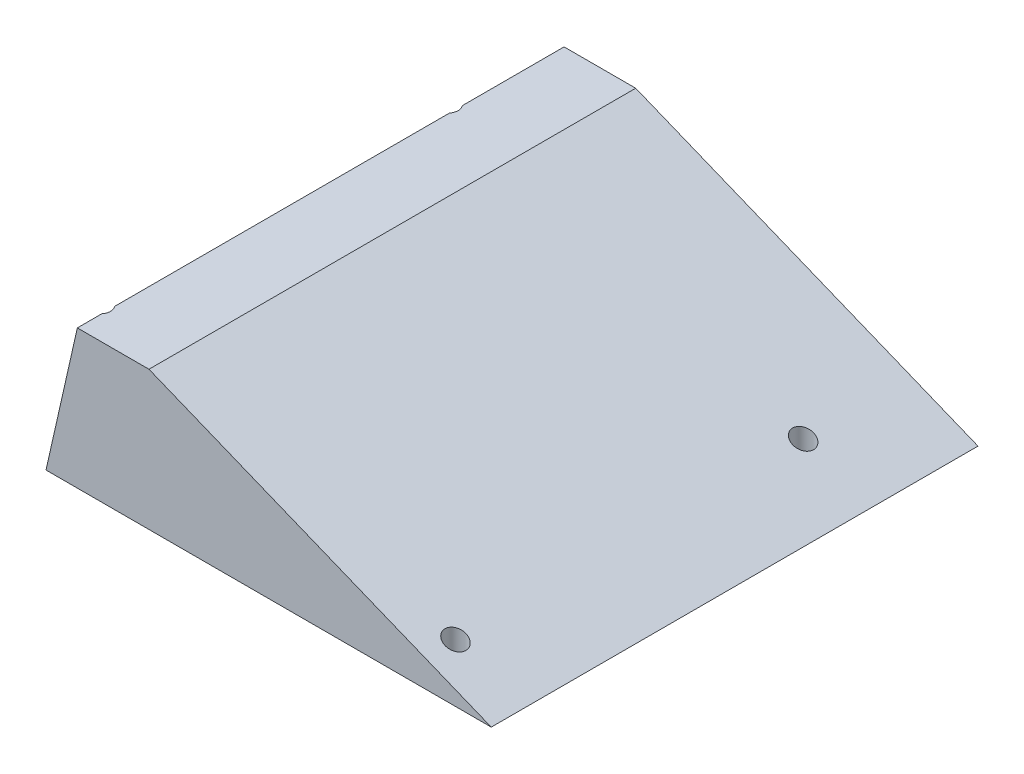
ISO-10303-21;
HEADER;
FILE_DESCRIPTION(('STEP AP214'),'2;1');
FILE_NAME('part.step','',(''),(''),'','','');
FILE_SCHEMA(('AUTOMOTIVE_DESIGN { 1 0 10303 214 1 1 1 1 }'));
ENDSEC;
DATA;
#1=APPLICATION_CONTEXT('core data for automotive mechanical design processes');
#2=APPLICATION_PROTOCOL_DEFINITION('international standard','automotive_design',2000,#1);
#3=PRODUCT_CONTEXT('',#1,'mechanical');
#4=PRODUCT('Part','Part','',(#3));
#5=PRODUCT_RELATED_PRODUCT_CATEGORY('part','',(#4));
#6=PRODUCT_DEFINITION_FORMATION('','',#4);
#7=PRODUCT_DEFINITION_CONTEXT('part definition',#1,'design');
#8=PRODUCT_DEFINITION('design','',#6,#7);
#9=PRODUCT_DEFINITION_SHAPE('','',#8);
#10=(LENGTH_UNIT() NAMED_UNIT(*) SI_UNIT(.MILLI.,.METRE.));
#11=(NAMED_UNIT(*) PLANE_ANGLE_UNIT() SI_UNIT($,.RADIAN.));
#12=(NAMED_UNIT(*) SI_UNIT($,.STERADIAN.) SOLID_ANGLE_UNIT());
#13=UNCERTAINTY_MEASURE_WITH_UNIT(LENGTH_MEASURE(1.E-05),#10,'distance_accuracy_value','');
#14=(GEOMETRIC_REPRESENTATION_CONTEXT(3) GLOBAL_UNCERTAINTY_ASSIGNED_CONTEXT((#13)) GLOBAL_UNIT_ASSIGNED_CONTEXT((#10,
#11,#12)) REPRESENTATION_CONTEXT('',''));
#15=CARTESIAN_POINT('',(0.,0.,0.));
#16=DIRECTION('',(0.,0.,1.));
#17=DIRECTION('',(1.,0.,0.));
#18=AXIS2_PLACEMENT_3D('',#15,#16,#17);
#19=CARTESIAN_POINT('',(13.4332721150903,10.8252450173548,63.));
#20=DIRECTION('',(-0.970371375639122,0.241618280227795,0.));
#21=DIRECTION('',(-0.241618280227795,-0.970371375639122,0.));
#22=AXIS2_PLACEMENT_3D('',#19,#20,#21);
#23=PLANE('',#22);
#24=DIRECTION('',(0.,0.,1.));
#25=VECTOR('',#24,1.);
#26=CARTESIAN_POINT('',(13.2277896710843,9.99999999999999,63.));
#27=LINE('',#26,#25);
#28=CARTESIAN_POINT('',(13.2277896710843,10.,0.));
#29=VERTEX_POINT('',#28);
#30=CARTESIAN_POINT('',(13.2277896710843,10.,8.));
#31=VERTEX_POINT('',#30);
#32=EDGE_CURVE('E183',#29,#31,#27,.T.);
#33=ORIENTED_EDGE('',*,*,#32,.F.);
#34=DIRECTION('',(0.241618280227795,0.970371375639122,0.));
#35=VECTOR('',#34,1.);
#36=CARTESIAN_POINT('',(13.4332721150903,10.8252450173548,0.));
#37=LINE('',#36,#35);
#38=CARTESIAN_POINT('',(13.4332721150903,10.8252450173548,0.));
#39=VERTEX_POINT('',#38);
#40=EDGE_CURVE('E205',#29,#39,#37,.T.);
#41=ORIENTED_EDGE('',*,*,#40,.T.);
#42=DIRECTION('',(0.,0.,-1.));
#43=VECTOR('',#42,1.);
#44=CARTESIAN_POINT('',(13.4332721150903,10.8252450173548,63.));
#45=LINE('',#44,#43);
#46=CARTESIAN_POINT('',(13.4332721150903,10.8252450173548,57.));
#47=VERTEX_POINT('',#46);
#48=EDGE_CURVE('E212',#47,#39,#45,.T.);
#49=ORIENTED_EDGE('',*,*,#48,.F.);
#50=DIRECTION('',(-0.241618280227795,-0.970371375639122,0.));
#51=VECTOR('',#50,1.);
#52=CARTESIAN_POINT('',(13.4332721150903,10.8252450173548,57.));
#53=LINE('',#52,#51);
#54=CARTESIAN_POINT('',(10.7378328741965,0.,57.));
#55=VERTEX_POINT('',#54);
#56=EDGE_CURVE('E189',#47,#55,#53,.T.);
#57=ORIENTED_EDGE('',*,*,#56,.T.);
#58=DIRECTION('',(0.,0.,-1.));
#59=VECTOR('',#58,1.);
#60=CARTESIAN_POINT('',(10.7378328741965,0.,63.));
#61=LINE('',#60,#59);
#62=CARTESIAN_POINT('',(10.7378328741965,0.,8.));
#63=VERTEX_POINT('',#62);
#64=EDGE_CURVE('E142',#55,#63,#61,.T.);
#65=ORIENTED_EDGE('',*,*,#64,.T.);
#66=DIRECTION('',(-0.241618280227795,-0.970371375639122,0.));
#67=VECTOR('',#66,1.);
#68=CARTESIAN_POINT('',(13.4332721150903,10.8252450173548,8.));
#69=LINE('',#68,#67);
#70=EDGE_CURVE('E187',#31,#63,#69,.T.);
#71=ORIENTED_EDGE('',*,*,#70,.F.);
#72=EDGE_LOOP('',(#33,#41,#49,#57,#65,#71));
#73=FACE_BOUND('',#72,.T.);
#74=ADVANCED_FACE('F32',(#73),#23,.F.);
#75=CARTESIAN_POINT('',(9.42653810835628,17.9645165202627,63.));
#76=DIRECTION('',(0.975427958578046,-0.220318627501776,0.));
#77=DIRECTION('',(0.220318627501776,0.975427958578046,0.));
#78=AXIS2_PLACEMENT_3D('',#75,#76,#77);
#79=PLANE('',#78);
#80=DIRECTION('',(0.,0.,-1.));
#81=VECTOR('',#80,1.);
#82=CARTESIAN_POINT('',(9.42653810835628,17.9645165202627,63.));
#83=LINE('',#82,#81);
#84=CARTESIAN_POINT('',(9.42653810835628,17.9645165202627,58.1609908221686));
#85=VERTEX_POINT('',#84);
#86=CARTESIAN_POINT('',(9.42653810835628,17.9645165202627,14.8390091778314));
#87=VERTEX_POINT('',#86);
#88=EDGE_CURVE('E129',#85,#87,#83,.T.);
#89=ORIENTED_EDGE('',*,*,#88,.T.);
#90=CARTESIAN_POINT('',(8.36891643709825,13.2820538549812,14.));
#91=DIRECTION('',(0.975427958578046,-0.220318627501776,0.));
#92=DIRECTION('',(-0.220318627501776,-0.975427958578046,0.));
#93=AXIS2_PLACEMENT_3D('',#90,#91,#92);
#94=ELLIPSE('',#93,6.12748915199699,1.35);
#95=CARTESIAN_POINT('',(9.42653810835628,17.9645165202627,13.1609908221686));
#96=VERTEX_POINT('',#95);
#97=EDGE_CURVE('E48',#87,#96,#94,.T.);
#98=ORIENTED_EDGE('',*,*,#97,.T.);
#99=CARTESIAN_POINT('',(9.42653810835628,17.9645165202627,0.));
#100=VERTEX_POINT('',#99);
#101=EDGE_CURVE('E127',#96,#100,#83,.T.);
#102=ORIENTED_EDGE('',*,*,#101,.T.);
#103=DIRECTION('',(-0.220318627501776,-0.975427958578046,0.));
#104=VECTOR('',#103,1.);
#105=CARTESIAN_POINT('',(9.42653810835628,17.9645165202627,0.));
#106=LINE('',#105,#104);
#107=CARTESIAN_POINT('',(7.62760325824444,10.,0.));
#108=VERTEX_POINT('',#107);
#109=EDGE_CURVE('E223',#100,#108,#106,.T.);
#110=ORIENTED_EDGE('',*,*,#109,.T.);
#111=DIRECTION('',(0.,0.,-1.));
#112=VECTOR('',#111,1.);
#113=CARTESIAN_POINT('',(7.62760325824444,9.99999999999999,63.));
#114=LINE('',#113,#112);
#115=CARTESIAN_POINT('',(7.62760325824444,10.,8.));
#116=VERTEX_POINT('',#115);
#117=EDGE_CURVE('E181',#116,#108,#114,.T.);
#118=ORIENTED_EDGE('',*,*,#117,.F.);
#119=DIRECTION('',(0.220318627501776,0.975427958578046,0.));
#120=VECTOR('',#119,1.);
#121=CARTESIAN_POINT('',(9.42653810835628,17.9645165202627,8.));
#122=LINE('',#121,#120);
#123=CARTESIAN_POINT('',(5.36891643709825,0.,8.));
#124=VERTEX_POINT('',#123);
#125=EDGE_CURVE('E185',#124,#116,#122,.T.);
#126=ORIENTED_EDGE('',*,*,#125,.F.);
#127=DIRECTION('',(0.,0.,-1.));
#128=VECTOR('',#127,1.);
#129=CARTESIAN_POINT('',(5.36891643709825,0.,63.));
#130=LINE('',#129,#128);
#131=CARTESIAN_POINT('',(5.36891643709825,0.,63.));
#132=VERTEX_POINT('',#131);
#133=EDGE_CURVE('E138',#132,#124,#130,.T.);
#134=ORIENTED_EDGE('',*,*,#133,.F.);
#135=DIRECTION('',(-0.220318627501776,-0.975427958578046,0.));
#136=VECTOR('',#135,1.);
#137=CARTESIAN_POINT('',(9.42653810835628,17.9645165202627,63.));
#138=LINE('',#137,#136);
#139=CARTESIAN_POINT('',(9.42653810835628,17.9645165202627,63.));
#140=VERTEX_POINT('',#139);
#141=EDGE_CURVE('E209',#140,#132,#138,.T.);
#142=ORIENTED_EDGE('',*,*,#141,.F.);
#143=CARTESIAN_POINT('',(9.42653810835628,17.9645165202627,59.8390091778314));
#144=VERTEX_POINT('',#143);
#145=EDGE_CURVE('E140',#140,#144,#83,.T.);
#146=ORIENTED_EDGE('',*,*,#145,.T.);
#147=CARTESIAN_POINT('',(8.36891643709825,13.2820538549812,59.));
#148=DIRECTION('',(0.975427958578046,-0.220318627501776,0.));
#149=DIRECTION('',(-0.220318627501776,-0.975427958578046,0.));
#150=AXIS2_PLACEMENT_3D('',#147,#148,#149);
#151=ELLIPSE('',#150,6.12748915199699,1.35);
#152=EDGE_CURVE('E54',#144,#85,#151,.T.);
#153=ORIENTED_EDGE('',*,*,#152,.T.);
#154=EDGE_LOOP('',(#89,#98,#102,#110,#118,#126,#134,#142,#146,#153));
#155=FACE_BOUND('',#154,.T.);
#156=ADVANCED_FACE('F125',(#155),#79,.F.);
#157=CARTESIAN_POINT('',(5.36891643709825,0.,63.));
#158=DIRECTION('',(0.,1.,0.));
#159=DIRECTION('',(0.,0.,1.));
#160=AXIS2_PLACEMENT_3D('',#157,#158,#159);
#161=PLANE('',#160);
#162=CARTESIAN_POINT('',(54.3689164370982,0.,59.));
#163=DIRECTION('',(0.,-1.,0.));
#164=DIRECTION('',(0.,0.,-1.));
#165=AXIS2_PLACEMENT_3D('',#162,#163,#164);
#166=CIRCLE('',#165,1.35);
#167=CARTESIAN_POINT('',(54.3689164370982,0.,57.65));
#168=VERTEX_POINT('',#167);
#169=EDGE_CURVE('E131',#168,#168,#166,.T.);
#170=ORIENTED_EDGE('',*,*,#169,.F.);
#171=EDGE_LOOP('',(#170));
#172=FACE_BOUND('',#171,.T.);
#173=CARTESIAN_POINT('',(54.3689164370983,0.,14.));
#174=DIRECTION('',(0.,-1.,0.));
#175=DIRECTION('',(0.,0.,-1.));
#176=AXIS2_PLACEMENT_3D('',#173,#174,#175);
#177=CIRCLE('',#176,1.35);
#178=CARTESIAN_POINT('',(54.3689164370983,0.,12.65));
#179=VERTEX_POINT('',#178);
#180=EDGE_CURVE('E374',#179,#179,#177,.T.);
#181=ORIENTED_EDGE('',*,*,#180,.F.);
#182=EDGE_LOOP('',(#181));
#183=FACE_BOUND('',#182,.T.);
#184=CARTESIAN_POINT('',(8.36891643709825,0.,14.));
#185=DIRECTION('',(0.,-1.,0.));
#186=DIRECTION('',(0.,0.,-1.));
#187=AXIS2_PLACEMENT_3D('',#184,#185,#186);
#188=CIRCLE('',#187,1.35);
#189=CARTESIAN_POINT('',(8.36891643709825,0.,12.65));
#190=VERTEX_POINT('',#189);
#191=EDGE_CURVE('E377',#190,#190,#188,.T.);
#192=ORIENTED_EDGE('',*,*,#191,.F.);
#193=EDGE_LOOP('',(#192));
#194=FACE_BOUND('',#193,.T.);
#195=CARTESIAN_POINT('',(8.36891643709825,0.,59.));
#196=DIRECTION('',(0.,-1.,0.));
#197=DIRECTION('',(0.,0.,-1.));
#198=AXIS2_PLACEMENT_3D('',#195,#196,#197);
#199=CIRCLE('',#198,1.35);
#200=CARTESIAN_POINT('',(8.36891643709825,0.,57.65));
#201=VERTEX_POINT('',#200);
#202=EDGE_CURVE('E166',#201,#201,#199,.T.);
#203=ORIENTED_EDGE('',*,*,#202,.F.);
#204=EDGE_LOOP('',(#203));
#205=FACE_BOUND('',#204,.T.);
#206=DIRECTION('',(-1.,0.,0.));
#207=VECTOR('',#206,1.);
#208=CARTESIAN_POINT('',(19.,0.,8.));
#209=LINE('',#208,#207);
#210=EDGE_CURVE('E173',#63,#124,#209,.T.);
#211=ORIENTED_EDGE('',*,*,#210,.F.);
#212=ORIENTED_EDGE('',*,*,#64,.F.);
#213=DIRECTION('',(1.,0.,0.));
#214=VECTOR('',#213,1.);
#215=CARTESIAN_POINT('',(10.7378328741965,0.,57.));
#216=LINE('',#215,#214);
#217=CARTESIAN_POINT('',(31.5,0.,57.));
#218=VERTEX_POINT('',#217);
#219=EDGE_CURVE('E192',#55,#218,#216,.T.);
#220=ORIENTED_EDGE('',*,*,#219,.T.);
#221=DIRECTION('',(0.,0.,-1.));
#222=VECTOR('',#221,1.);
#223=CARTESIAN_POINT('',(31.5,0.,63.));
#224=LINE('',#223,#222);
#225=CARTESIAN_POINT('',(31.5,0.,0.));
#226=VERTEX_POINT('',#225);
#227=EDGE_CURVE('E153',#218,#226,#224,.T.);
#228=ORIENTED_EDGE('',*,*,#227,.T.);
#229=DIRECTION('',(1.,0.,0.));
#230=VECTOR('',#229,1.);
#231=CARTESIAN_POINT('',(31.5,0.,0.));
#232=LINE('',#231,#230);
#233=CARTESIAN_POINT('',(63.,0.,0.));
#234=VERTEX_POINT('',#233);
#235=EDGE_CURVE('E218',#226,#234,#232,.T.);
#236=ORIENTED_EDGE('',*,*,#235,.T.);
#237=DIRECTION('',(0.,0.,-1.));
#238=VECTOR('',#237,1.);
#239=CARTESIAN_POINT('',(63.,0.,63.));
#240=LINE('',#239,#238);
#241=CARTESIAN_POINT('',(63.,0.,63.));
#242=VERTEX_POINT('',#241);
#243=EDGE_CURVE('E149',#242,#234,#240,.T.);
#244=ORIENTED_EDGE('',*,*,#243,.F.);
#245=DIRECTION('',(1.,0.,0.));
#246=VECTOR('',#245,1.);
#247=CARTESIAN_POINT('',(31.5,0.,63.));
#248=LINE('',#247,#246);
#249=EDGE_CURVE('E202',#132,#242,#248,.T.);
#250=ORIENTED_EDGE('',*,*,#249,.F.);
#251=ORIENTED_EDGE('',*,*,#133,.T.);
#252=EDGE_LOOP('',(#211,#212,#220,#228,#236,#244,#250,#251));
#253=FACE_BOUND('',#252,.T.);
#254=ADVANCED_FACE('F236',(#172,#183,#194,#205,#253),#161,.F.);
#255=CARTESIAN_POINT('',(0.,0.,0.));
#256=DIRECTION('',(0.,0.,-1.));
#257=DIRECTION('',(-1.,0.,0.));
#258=AXIS2_PLACEMENT_3D('',#255,#256,#257);
#259=PLANE('',#258);
#260=ORIENTED_EDGE('',*,*,#40,.F.);
#261=DIRECTION('',(-1.,0.,0.));
#262=VECTOR('',#261,1.);
#263=CARTESIAN_POINT('',(0.,10.,0.));
#264=LINE('',#263,#262);
#265=EDGE_CURVE('E159',#29,#108,#264,.T.);
#266=ORIENTED_EDGE('',*,*,#265,.T.);
#267=ORIENTED_EDGE('',*,*,#109,.F.);
#268=DIRECTION('',(-1.,0.,0.));
#269=VECTOR('',#268,1.);
#270=CARTESIAN_POINT('',(18.6961575847282,17.9645165202627,0.));
#271=LINE('',#270,#269);
#272=CARTESIAN_POINT('',(18.6961575847282,17.9645165202627,0.));
#273=VERTEX_POINT('',#272);
#274=EDGE_CURVE('E136',#273,#100,#271,.T.);
#275=ORIENTED_EDGE('',*,*,#274,.F.);
#276=DIRECTION('',(-0.926713780591244,0.375767972108166,0.));
#277=VECTOR('',#276,1.);
#278=CARTESIAN_POINT('',(63.,0.,0.));
#279=LINE('',#278,#277);
#280=EDGE_CURVE('E220',#234,#273,#279,.T.);
#281=ORIENTED_EDGE('',*,*,#280,.F.);
#282=ORIENTED_EDGE('',*,*,#235,.F.);
#283=DIRECTION('',(0.364550638650222,-0.93118356507174,0.));
#284=VECTOR('',#283,1.);
#285=CARTESIAN_POINT('',(27.2620064049157,10.8252450173548,0.));
#286=LINE('',#285,#284);
#287=CARTESIAN_POINT('',(27.2620064049157,10.8252450173548,0.));
#288=VERTEX_POINT('',#287);
#289=EDGE_CURVE('E215',#288,#226,#286,.T.);
#290=ORIENTED_EDGE('',*,*,#289,.F.);
#291=DIRECTION('',(1.,0.,0.));
#292=VECTOR('',#291,1.);
#293=CARTESIAN_POINT('',(13.4332721150903,10.8252450173548,0.));
#294=LINE('',#293,#292);
#295=EDGE_CURVE('E201',#39,#288,#294,.T.);
#296=ORIENTED_EDGE('',*,*,#295,.F.);
#297=EDGE_LOOP('',(#260,#266,#267,#275,#281,#282,#290,#296));
#298=FACE_BOUND('',#297,.T.);
#299=ADVANCED_FACE('F248',(#298),#259,.T.);
#300=CARTESIAN_POINT('',(13.4332721150903,10.8252450173548,63.));
#301=DIRECTION('',(0.,1.,0.));
#302=DIRECTION('',(0.,0.,1.));
#303=AXIS2_PLACEMENT_3D('',#300,#301,#302);
#304=PLANE('',#303);
#305=DIRECTION('',(-1.,0.,0.));
#306=VECTOR('',#305,1.);
#307=CARTESIAN_POINT('',(27.2620064049157,10.8252450173548,57.));
#308=LINE('',#307,#306);
#309=CARTESIAN_POINT('',(27.2620064049157,10.8252450173548,57.));
#310=VERTEX_POINT('',#309);
#311=EDGE_CURVE('E198',#310,#47,#308,.T.);
#312=ORIENTED_EDGE('',*,*,#311,.T.);
#313=ORIENTED_EDGE('',*,*,#48,.T.);
#314=ORIENTED_EDGE('',*,*,#295,.T.);
#315=DIRECTION('',(0.,0.,-1.));
#316=VECTOR('',#315,1.);
#317=CARTESIAN_POINT('',(27.2620064049157,10.8252450173548,63.));
#318=LINE('',#317,#316);
#319=EDGE_CURVE('E157',#310,#288,#318,.T.);
#320=ORIENTED_EDGE('',*,*,#319,.F.);
#321=EDGE_LOOP('',(#312,#313,#314,#320));
#322=FACE_BOUND('',#321,.T.);
#323=ADVANCED_FACE('F34',(#322),#304,.F.);
#324=CARTESIAN_POINT('',(27.2620064049157,10.8252450173548,63.));
#325=DIRECTION('',(0.93118356507174,0.364550638650222,0.));
#326=DIRECTION('',(-0.364550638650222,0.93118356507174,0.));
#327=AXIS2_PLACEMENT_3D('',#324,#325,#326);
#328=PLANE('',#327);
#329=DIRECTION('',(-0.364550638650222,0.93118356507174,0.));
#330=VECTOR('',#329,1.);
#331=CARTESIAN_POINT('',(31.5,0.,57.));
#332=LINE('',#331,#330);
#333=EDGE_CURVE('E195',#218,#310,#332,.T.);
#334=ORIENTED_EDGE('',*,*,#333,.T.);
#335=ORIENTED_EDGE('',*,*,#319,.T.);
#336=ORIENTED_EDGE('',*,*,#289,.T.);
#337=ORIENTED_EDGE('',*,*,#227,.F.);
#338=EDGE_LOOP('',(#334,#335,#336,#337));
#339=FACE_BOUND('',#338,.T.);
#340=ADVANCED_FACE('F256',(#339),#328,.F.);
#341=CARTESIAN_POINT('',(63.,0.,63.));
#342=DIRECTION('',(-0.375767972108166,-0.926713780591244,0.));
#343=DIRECTION('',(0.926713780591244,-0.375767972108166,0.));
#344=AXIS2_PLACEMENT_3D('',#341,#342,#343);
#345=PLANE('',#344);
#346=CARTESIAN_POINT('',(54.3689164370982,3.49976965429229,59.));
#347=DIRECTION('',(-0.375767972108166,-0.926713780591244,0.));
#348=DIRECTION('',(0.926713780591244,-0.375767972108166,0.));
#349=AXIS2_PLACEMENT_3D('',#346,#347,#348);
#350=ELLIPSE('',#349,1.45676046722721,1.35);
#351=CARTESIAN_POINT('',(55.7189164370982,2.95236572767498,59.));
#352=VERTEX_POINT('',#351);
#353=EDGE_CURVE('E36',#352,#352,#350,.T.);
#354=ORIENTED_EDGE('',*,*,#353,.T.);
#355=EDGE_LOOP('',(#354));
#356=FACE_BOUND('',#355,.T.);
#357=CARTESIAN_POINT('',(54.3689164370983,3.49976965429229,14.));
#358=DIRECTION('',(-0.375767972108166,-0.926713780591244,0.));
#359=DIRECTION('',(0.926713780591244,-0.375767972108166,0.));
#360=AXIS2_PLACEMENT_3D('',#357,#358,#359);
#361=ELLIPSE('',#360,1.45676046722721,1.35);
#362=CARTESIAN_POINT('',(55.7189164370983,2.95236572767498,14.));
#363=VERTEX_POINT('',#362);
#364=EDGE_CURVE('E130',#363,#363,#361,.T.);
#365=ORIENTED_EDGE('',*,*,#364,.T.);
#366=EDGE_LOOP('',(#365));
#367=FACE_BOUND('',#366,.T.);
#368=ORIENTED_EDGE('',*,*,#280,.T.);
#369=DIRECTION('',(0.,0.,-1.));
#370=VECTOR('',#369,1.);
#371=CARTESIAN_POINT('',(18.6961575847282,17.9645165202627,63.));
#372=LINE('',#371,#370);
#373=CARTESIAN_POINT('',(18.6961575847282,17.9645165202627,63.));
#374=VERTEX_POINT('',#373);
#375=EDGE_CURVE('E146',#374,#273,#372,.T.);
#376=ORIENTED_EDGE('',*,*,#375,.F.);
#377=DIRECTION('',(-0.926713780591244,0.375767972108166,0.));
#378=VECTOR('',#377,1.);
#379=CARTESIAN_POINT('',(63.,0.,63.));
#380=LINE('',#379,#378);
#381=EDGE_CURVE('E204',#242,#374,#380,.T.);
#382=ORIENTED_EDGE('',*,*,#381,.F.);
#383=ORIENTED_EDGE('',*,*,#243,.T.);
#384=EDGE_LOOP('',(#368,#376,#382,#383));
#385=FACE_BOUND('',#384,.T.);
#386=ADVANCED_FACE('F262',(#356,#367,#385),#345,.F.);
#387=CARTESIAN_POINT('',(18.6961575847282,17.9645165202627,63.));
#388=DIRECTION('',(0.,-1.,0.));
#389=DIRECTION('',(1.,0.,0.));
#390=AXIS2_PLACEMENT_3D('',#387,#388,#389);
#391=PLANE('',#390);
#392=ORIENTED_EDGE('',*,*,#101,.F.);
#393=CARTESIAN_POINT('',(8.36891643709825,17.9645165202627,14.));
#394=DIRECTION('',(0.,-1.,0.));
#395=DIRECTION('',(1.,0.,0.));
#396=AXIS2_PLACEMENT_3D('',#393,#394,#395);
#397=CIRCLE('',#396,1.35);
#398=EDGE_CURVE('E11',#96,#87,#397,.T.);
#399=ORIENTED_EDGE('',*,*,#398,.T.);
#400=ORIENTED_EDGE('',*,*,#88,.F.);
#401=CARTESIAN_POINT('',(8.36891643709825,17.9645165202627,59.));
#402=DIRECTION('',(0.,-1.,0.));
#403=DIRECTION('',(1.,0.,0.));
#404=AXIS2_PLACEMENT_3D('',#401,#402,#403);
#405=CIRCLE('',#404,1.35);
#406=EDGE_CURVE('E41',#85,#144,#405,.T.);
#407=ORIENTED_EDGE('',*,*,#406,.T.);
#408=ORIENTED_EDGE('',*,*,#145,.F.);
#409=DIRECTION('',(-1.,0.,0.));
#410=VECTOR('',#409,1.);
#411=CARTESIAN_POINT('',(18.6961575847282,17.9645165202627,63.));
#412=LINE('',#411,#410);
#413=EDGE_CURVE('E207',#374,#140,#412,.T.);
#414=ORIENTED_EDGE('',*,*,#413,.F.);
#415=ORIENTED_EDGE('',*,*,#375,.T.);
#416=ORIENTED_EDGE('',*,*,#274,.T.);
#417=EDGE_LOOP('',(#392,#399,#400,#407,#408,#414,#415,#416));
#418=FACE_BOUND('',#417,.T.);
#419=ADVANCED_FACE('F133',(#418),#391,.F.);
#420=CARTESIAN_POINT('',(0.,0.,63.));
#421=DIRECTION('',(0.,0.,-1.));
#422=DIRECTION('',(-1.,0.,0.));
#423=AXIS2_PLACEMENT_3D('',#420,#421,#422);
#424=PLANE('',#423);
#425=ORIENTED_EDGE('',*,*,#141,.T.);
#426=ORIENTED_EDGE('',*,*,#249,.T.);
#427=ORIENTED_EDGE('',*,*,#381,.T.);
#428=ORIENTED_EDGE('',*,*,#413,.T.);
#429=EDGE_LOOP('',(#425,#426,#427,#428));
#430=FACE_BOUND('',#429,.T.);
#431=ADVANCED_FACE('F264',(#430),#424,.F.);
#432=CARTESIAN_POINT('',(0.,0.,57.));
#433=DIRECTION('',(0.,0.,1.));
#434=DIRECTION('',(1.,0.,0.));
#435=AXIS2_PLACEMENT_3D('',#432,#433,#434);
#436=PLANE('',#435);
#437=ORIENTED_EDGE('',*,*,#56,.F.);
#438=ORIENTED_EDGE('',*,*,#311,.F.);
#439=ORIENTED_EDGE('',*,*,#333,.F.);
#440=ORIENTED_EDGE('',*,*,#219,.F.);
#441=EDGE_LOOP('',(#437,#438,#439,#440));
#442=FACE_BOUND('',#441,.T.);
#443=ADVANCED_FACE('F254',(#442),#436,.F.);
#444=CARTESIAN_POINT('',(19.,10.,8.));
#445=DIRECTION('',(0.,0.,-1.));
#446=DIRECTION('',(-1.,0.,0.));
#447=AXIS2_PLACEMENT_3D('',#444,#445,#446);
#448=PLANE('',#447);
#449=ORIENTED_EDGE('',*,*,#70,.T.);
#450=ORIENTED_EDGE('',*,*,#210,.T.);
#451=ORIENTED_EDGE('',*,*,#125,.T.);
#452=DIRECTION('',(-1.,0.,0.));
#453=VECTOR('',#452,1.);
#454=CARTESIAN_POINT('',(19.,10.,8.));
#455=LINE('',#454,#453);
#456=EDGE_CURVE('E178',#31,#116,#455,.T.);
#457=ORIENTED_EDGE('',*,*,#456,.F.);
#458=EDGE_LOOP('',(#449,#450,#451,#457));
#459=FACE_BOUND('',#458,.T.);
#460=ADVANCED_FACE('F241',(#459),#448,.T.);
#461=CARTESIAN_POINT('',(19.,10.,0.));
#462=DIRECTION('',(0.,-1.,0.));
#463=DIRECTION('',(0.,0.,-1.));
#464=AXIS2_PLACEMENT_3D('',#461,#462,#463);
#465=PLANE('',#464);
#466=ORIENTED_EDGE('',*,*,#32,.T.);
#467=ORIENTED_EDGE('',*,*,#456,.T.);
#468=ORIENTED_EDGE('',*,*,#117,.T.);
#469=ORIENTED_EDGE('',*,*,#265,.F.);
#470=EDGE_LOOP('',(#466,#467,#468,#469));
#471=FACE_BOUND('',#470,.T.);
#472=ADVANCED_FACE('F245',(#471),#465,.T.);
#473=CARTESIAN_POINT('',(8.36891643709825,27.,59.));
#474=DIRECTION('',(0.,-1.,0.));
#475=DIRECTION('',(0.,0.,-1.));
#476=AXIS2_PLACEMENT_3D('',#473,#474,#475);
#477=CYLINDRICAL_SURFACE('',#476,1.35);
#478=ORIENTED_EDGE('',*,*,#202,.T.);
#479=EDGE_LOOP('',(#478));
#480=FACE_BOUND('',#479,.T.);
#481=ORIENTED_EDGE('',*,*,#406,.F.);
#482=ORIENTED_EDGE('',*,*,#152,.F.);
#483=EDGE_LOOP('',(#481,#482));
#484=FACE_BOUND('',#483,.T.);
#485=ADVANCED_FACE('F265',(#480,#484),#477,.F.);
#486=CARTESIAN_POINT('',(8.36891643709825,27.,14.));
#487=DIRECTION('',(0.,-1.,0.));
#488=DIRECTION('',(0.,0.,-1.));
#489=AXIS2_PLACEMENT_3D('',#486,#487,#488);
#490=CYLINDRICAL_SURFACE('',#489,1.35);
#491=ORIENTED_EDGE('',*,*,#191,.T.);
#492=EDGE_LOOP('',(#491));
#493=FACE_BOUND('',#492,.T.);
#494=ORIENTED_EDGE('',*,*,#398,.F.);
#495=ORIENTED_EDGE('',*,*,#97,.F.);
#496=EDGE_LOOP('',(#494,#495));
#497=FACE_BOUND('',#496,.T.);
#498=ADVANCED_FACE('F119',(#493,#497),#490,.F.);
#499=CARTESIAN_POINT('',(54.3689164370983,27.,14.));
#500=DIRECTION('',(0.,-1.,0.));
#501=DIRECTION('',(0.,0.,-1.));
#502=AXIS2_PLACEMENT_3D('',#499,#500,#501);
#503=CYLINDRICAL_SURFACE('',#502,1.35);
#504=ORIENTED_EDGE('',*,*,#180,.T.);
#505=EDGE_LOOP('',(#504));
#506=FACE_BOUND('',#505,.T.);
#507=ORIENTED_EDGE('',*,*,#364,.F.);
#508=EDGE_LOOP('',(#507));
#509=FACE_BOUND('',#508,.T.);
#510=ADVANCED_FACE('F272',(#506,#509),#503,.F.);
#511=CARTESIAN_POINT('',(54.3689164370982,27.,59.));
#512=DIRECTION('',(0.,-1.,0.));
#513=DIRECTION('',(0.,0.,-1.));
#514=AXIS2_PLACEMENT_3D('',#511,#512,#513);
#515=CYLINDRICAL_SURFACE('',#514,1.35);
#516=ORIENTED_EDGE('',*,*,#169,.T.);
#517=EDGE_LOOP('',(#516));
#518=FACE_BOUND('',#517,.T.);
#519=ORIENTED_EDGE('',*,*,#353,.F.);
#520=EDGE_LOOP('',(#519));
#521=FACE_BOUND('',#520,.T.);
#522=ADVANCED_FACE('F357',(#518,#521),#515,.F.);
#523=CLOSED_SHELL('',(#74,#156,#254,#299,#323,#340,#386,#419,#431,#443,#460,#472,#485,#498,#510,#522));
#524=MANIFOLD_SOLID_BREP('B2',#523);
#525=ADVANCED_BREP_SHAPE_REPRESENTATION('',(#18,#524),#14);
#526=SHAPE_DEFINITION_REPRESENTATION(#9,#525);
ENDSEC;
END-ISO-10303-21;
